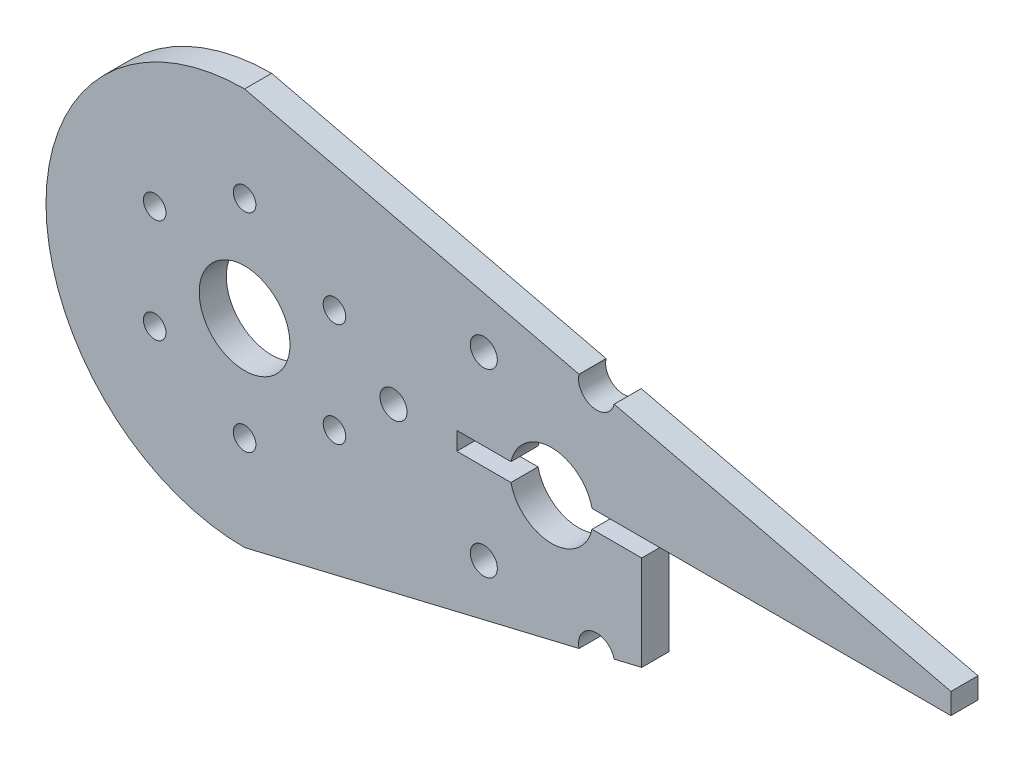
ISO-10303-21;
HEADER;
FILE_DESCRIPTION(('STEP AP214'),'2;1');
FILE_NAME('part.step','',(''),(''),'','','');
FILE_SCHEMA(('AUTOMOTIVE_DESIGN { 1 0 10303 214 1 1 1 1 }'));
ENDSEC;
DATA;
#1=APPLICATION_CONTEXT('core data for automotive mechanical design processes');
#2=APPLICATION_PROTOCOL_DEFINITION('international standard','automotive_design',2000,#1);
#3=PRODUCT_CONTEXT('',#1,'mechanical');
#4=PRODUCT('Part','Part','',(#3));
#5=PRODUCT_RELATED_PRODUCT_CATEGORY('part','',(#4));
#6=PRODUCT_DEFINITION_FORMATION('','',#4);
#7=PRODUCT_DEFINITION_CONTEXT('part definition',#1,'design');
#8=PRODUCT_DEFINITION('design','',#6,#7);
#9=PRODUCT_DEFINITION_SHAPE('','',#8);
#10=(LENGTH_UNIT() NAMED_UNIT(*) SI_UNIT(.MILLI.,.METRE.));
#11=(NAMED_UNIT(*) PLANE_ANGLE_UNIT() SI_UNIT($,.RADIAN.));
#12=(NAMED_UNIT(*) SI_UNIT($,.STERADIAN.) SOLID_ANGLE_UNIT());
#13=UNCERTAINTY_MEASURE_WITH_UNIT(LENGTH_MEASURE(1.E-05),#10,'distance_accuracy_value','');
#14=(GEOMETRIC_REPRESENTATION_CONTEXT(3) GLOBAL_UNCERTAINTY_ASSIGNED_CONTEXT((#13)) GLOBAL_UNIT_ASSIGNED_CONTEXT((#10,
#11,#12)) REPRESENTATION_CONTEXT('',''));
#15=CARTESIAN_POINT('',(0.,0.,0.));
#16=DIRECTION('',(0.,0.,1.));
#17=DIRECTION('',(1.,0.,0.));
#18=AXIS2_PLACEMENT_3D('',#15,#16,#17);
#19=CARTESIAN_POINT('',(5.00100483165142,-11.5010048316527,3.));
#20=DIRECTION('',(-0.232139621887318,0.972682474371782,0.));
#21=DIRECTION('',(-0.972682474371782,-0.232139621887318,0.));
#22=AXIS2_PLACEMENT_3D('',#19,#20,#21);
#23=PLANE('',#22);
#24=DIRECTION('',(0.972682474371782,0.232139621887318,0.));
#25=VECTOR('',#24,1.);
#26=CARTESIAN_POINT('',(5.00100483165142,-11.5010048316527,3.));
#27=LINE('',#26,#25);
#28=CARTESIAN_POINT('',(1.94536494874356,-12.2302614037938,3.));
#29=VERTEX_POINT('',#28);
#30=CARTESIAN_POINT('',(5.00100483165142,-11.5010048316527,3.));
#31=VERTEX_POINT('',#30);
#32=EDGE_CURVE('E229',#29,#31,#27,.T.);
#33=ORIENTED_EDGE('',*,*,#32,.F.);
#34=DIRECTION('',(0.,0.,-1.));
#35=VECTOR('',#34,1.);
#36=CARTESIAN_POINT('',(1.94536494874356,-12.2302614037938,4.));
#37=LINE('',#36,#35);
#38=CARTESIAN_POINT('',(1.94536494874356,-12.2302614037938,0.));
#39=VERTEX_POINT('',#38);
#40=EDGE_CURVE('E11',#29,#39,#37,.T.);
#41=ORIENTED_EDGE('',*,*,#40,.T.);
#42=DIRECTION('',(0.972682474371782,0.232139621887318,0.));
#43=VECTOR('',#42,1.);
#44=CARTESIAN_POINT('',(5.00100483165142,-11.5010048316527,0.));
#45=LINE('',#44,#43);
#46=CARTESIAN_POINT('',(5.00100483165142,-11.5010048316527,0.));
#47=VERTEX_POINT('',#46);
#48=EDGE_CURVE('E254',#39,#47,#45,.T.);
#49=ORIENTED_EDGE('',*,*,#48,.T.);
#50=DIRECTION('',(0.,0.,-1.));
#51=VECTOR('',#50,1.);
#52=CARTESIAN_POINT('',(5.00100483165142,-11.5010048316527,3.));
#53=LINE('',#52,#51);
#54=EDGE_CURVE('E208',#31,#47,#53,.T.);
#55=ORIENTED_EDGE('',*,*,#54,.F.);
#56=EDGE_LOOP('',(#33,#41,#49,#55));
#57=FACE_BOUND('',#56,.T.);
#58=ADVANCED_FACE('F35',(#57),#23,.F.);
#59=CARTESIAN_POINT('',(5.00100483165142,11.5010048316527,3.));
#60=DIRECTION('',(-0.232139621887318,-0.972682474371782,0.));
#61=DIRECTION('',(0.972682474371782,-0.232139621887318,0.));
#62=AXIS2_PLACEMENT_3D('',#59,#60,#61);
#63=PLANE('',#62);
#64=DIRECTION('',(-0.972682474371782,0.232139621887318,0.));
#65=VECTOR('',#64,1.);
#66=CARTESIAN_POINT('',(5.00100483165142,11.5010048316527,3.));
#67=LINE('',#66,#65);
#68=CARTESIAN_POINT('',(-1.94536494874356,13.158819891343,3.));
#69=VERTEX_POINT('',#68);
#70=CARTESIAN_POINT('',(-38.9989951683486,22.0020096633054,3.));
#71=VERTEX_POINT('',#70);
#72=EDGE_CURVE('E162',#69,#71,#67,.T.);
#73=ORIENTED_EDGE('',*,*,#72,.F.);
#74=DIRECTION('',(0.,0.,-1.));
#75=VECTOR('',#74,1.);
#76=CARTESIAN_POINT('',(-1.94536494874356,13.158819891343,4.));
#77=LINE('',#76,#75);
#78=CARTESIAN_POINT('',(-1.94536494874356,13.158819891343,0.));
#79=VERTEX_POINT('',#78);
#80=EDGE_CURVE('E149',#69,#79,#77,.T.);
#81=ORIENTED_EDGE('',*,*,#80,.T.);
#82=DIRECTION('',(-0.972682474371782,0.232139621887318,0.));
#83=VECTOR('',#82,1.);
#84=CARTESIAN_POINT('',(5.00100483165142,11.5010048316527,0.));
#85=LINE('',#84,#83);
#86=CARTESIAN_POINT('',(-38.9989951683486,22.0020096633054,0.));
#87=VERTEX_POINT('',#86);
#88=EDGE_CURVE('E160',#79,#87,#85,.T.);
#89=ORIENTED_EDGE('',*,*,#88,.T.);
#90=DIRECTION('',(0.,0.,-1.));
#91=VECTOR('',#90,1.);
#92=CARTESIAN_POINT('',(-38.9989951683486,22.0020096633054,3.));
#93=LINE('',#92,#91);
#94=EDGE_CURVE('E178',#71,#87,#93,.T.);
#95=ORIENTED_EDGE('',*,*,#94,.F.);
#96=EDGE_LOOP('',(#73,#81,#89,#95));
#97=FACE_BOUND('',#96,.T.);
#98=ADVANCED_FACE('F158',(#97),#63,.F.);
#99=CARTESIAN_POINT('',(-38.9989951683486,0.,3.));
#100=DIRECTION('',(0.,0.,1.));
#101=DIRECTION('',(1.,0.,0.));
#102=AXIS2_PLACEMENT_3D('',#99,#100,#101);
#103=PLANE('',#102);
#104=CARTESIAN_POINT('',(0.,12.6945406475684,3.));
#105=DIRECTION('',(0.,0.,1.));
#106=DIRECTION('',(1.,0.,0.));
#107=AXIS2_PLACEMENT_3D('',#104,#105,#106);
#108=CIRCLE('',#107,2.);
#109=CARTESIAN_POINT('',(1.94536494874357,12.2302614037938,3.));
#110=VERTEX_POINT('',#109);
#111=EDGE_CURVE('E58',#69,#110,#108,.T.);
#112=ORIENTED_EDGE('',*,*,#111,.F.);
#113=ORIENTED_EDGE('',*,*,#72,.T.);
#114=CARTESIAN_POINT('',(-38.9989951683486,0.,3.));
#115=DIRECTION('',(0.,0.,1.));
#116=DIRECTION('',(1.,0.,0.));
#117=AXIS2_PLACEMENT_3D('',#114,#115,#116);
#118=CIRCLE('',#117,22.0020096633054);
#119=CARTESIAN_POINT('',(-38.9989951683486,-22.0020096633054,3.));
#120=VERTEX_POINT('',#119);
#121=EDGE_CURVE('E172',#71,#120,#118,.T.);
#122=ORIENTED_EDGE('',*,*,#121,.T.);
#123=CARTESIAN_POINT('',(-1.94536494874357,-13.158819891343,3.));
#124=VERTEX_POINT('',#123);
#125=EDGE_CURVE('E218',#120,#124,#27,.T.);
#126=ORIENTED_EDGE('',*,*,#125,.T.);
#127=CARTESIAN_POINT('',(0.,-12.6945406475684,3.));
#128=DIRECTION('',(0.,0.,1.));
#129=DIRECTION('',(1.,0.,0.));
#130=AXIS2_PLACEMENT_3D('',#127,#128,#129);
#131=CIRCLE('',#130,2.);
#132=EDGE_CURVE('E50',#29,#124,#131,.T.);
#133=ORIENTED_EDGE('',*,*,#132,.F.);
#134=ORIENTED_EDGE('',*,*,#32,.T.);
#135=DIRECTION('',(0.,1.,0.));
#136=VECTOR('',#135,1.);
#137=CARTESIAN_POINT('',(5.00100483165142,-1.,3.));
#138=LINE('',#137,#136);
#139=CARTESIAN_POINT('',(5.00100483165142,-1.,3.));
#140=VERTEX_POINT('',#139);
#141=EDGE_CURVE('E228',#31,#140,#138,.T.);
#142=ORIENTED_EDGE('',*,*,#141,.T.);
#143=DIRECTION('',(-1.,0.,0.));
#144=VECTOR('',#143,1.);
#145=CARTESIAN_POINT('',(5.00100483165142,-1.,3.));
#146=LINE('',#145,#144);
#147=CARTESIAN_POINT('',(-0.509006304219855,-1.,3.));
#148=VERTEX_POINT('',#147);
#149=EDGE_CURVE('E231',#140,#148,#146,.T.);
#150=ORIENTED_EDGE('',*,*,#149,.T.);
#151=CARTESIAN_POINT('',(-4.99899516834858,0.,3.));
#152=DIRECTION('',(0.,0.,-1.));
#153=DIRECTION('',(-1.,0.,0.));
#154=AXIS2_PLACEMENT_3D('',#151,#152,#153);
#155=CIRCLE('',#154,4.6);
#156=CARTESIAN_POINT('',(-9.48898403247731,-1.,3.));
#157=VERTEX_POINT('',#156);
#158=EDGE_CURVE('E237',#148,#157,#155,.T.);
#159=ORIENTED_EDGE('',*,*,#158,.T.);
#160=DIRECTION('',(-1.,0.,0.));
#161=VECTOR('',#160,1.);
#162=CARTESIAN_POINT('',(-15.4889840324773,-1.,3.));
#163=LINE('',#162,#161);
#164=CARTESIAN_POINT('',(-15.4889840324773,-1.,3.));
#165=VERTEX_POINT('',#164);
#166=EDGE_CURVE('E239',#157,#165,#163,.T.);
#167=ORIENTED_EDGE('',*,*,#166,.T.);
#168=DIRECTION('',(0.,1.,0.));
#169=VECTOR('',#168,1.);
#170=CARTESIAN_POINT('',(-15.4889840324773,1.,3.));
#171=LINE('',#170,#169);
#172=CARTESIAN_POINT('',(-15.4889840324773,1.,3.));
#173=VERTEX_POINT('',#172);
#174=EDGE_CURVE('E241',#165,#173,#171,.T.);
#175=ORIENTED_EDGE('',*,*,#174,.T.);
#176=DIRECTION('',(1.,0.,0.));
#177=VECTOR('',#176,1.);
#178=CARTESIAN_POINT('',(-15.4889840324773,1.,3.));
#179=LINE('',#178,#177);
#180=CARTESIAN_POINT('',(-9.48898403247731,1.,3.));
#181=VERTEX_POINT('',#180);
#182=EDGE_CURVE('E243',#173,#181,#179,.T.);
#183=ORIENTED_EDGE('',*,*,#182,.T.);
#184=CARTESIAN_POINT('',(-4.99899516834858,0.,3.));
#185=DIRECTION('',(0.,0.,-1.));
#186=DIRECTION('',(1.,0.,0.));
#187=AXIS2_PLACEMENT_3D('',#184,#185,#186);
#188=CIRCLE('',#187,4.6);
#189=CARTESIAN_POINT('',(-0.509006304219855,1.,3.));
#190=VERTEX_POINT('',#189);
#191=EDGE_CURVE('E245',#181,#190,#188,.T.);
#192=ORIENTED_EDGE('',*,*,#191,.T.);
#193=DIRECTION('',(1.,0.,0.));
#194=VECTOR('',#193,1.);
#195=CARTESIAN_POINT('',(5.00100483165142,1.,3.));
#196=LINE('',#195,#194);
#197=CARTESIAN_POINT('',(39.2548128748764,1.,3.));
#198=VERTEX_POINT('',#197);
#199=EDGE_CURVE('E247',#190,#198,#196,.T.);
#200=ORIENTED_EDGE('',*,*,#199,.T.);
#201=DIRECTION('',(0.,1.,0.));
#202=VECTOR('',#201,1.);
#203=CARTESIAN_POINT('',(39.2548128748764,3.32601838246157,3.));
#204=LINE('',#203,#202);
#205=CARTESIAN_POINT('',(39.2548128748764,3.32601838246157,3.));
#206=VERTEX_POINT('',#205);
#207=EDGE_CURVE('E249',#198,#206,#204,.T.);
#208=ORIENTED_EDGE('',*,*,#207,.T.);
#209=EDGE_CURVE('E181',#206,#110,#67,.T.);
#210=ORIENTED_EDGE('',*,*,#209,.T.);
#211=EDGE_LOOP('',(#112,#113,#122,#126,#133,#134,#142,#150,#159,#167,#175,#183,#192,#200,#208,#210));
#212=FACE_BOUND('',#211,.T.);
#213=CARTESIAN_POINT('',(-29.0397030248275,5.7499999999999,3.));
#214=DIRECTION('',(0.,0.,1.));
#215=DIRECTION('',(1.,0.,0.));
#216=AXIS2_PLACEMENT_3D('',#213,#214,#215);
#217=CIRCLE('',#216,1.25);
#218=CARTESIAN_POINT('',(-27.7897030248275,5.7499999999999,3.));
#219=VERTEX_POINT('',#218);
#220=EDGE_CURVE('E333',#219,#219,#217,.T.);
#221=ORIENTED_EDGE('',*,*,#220,.F.);
#222=EDGE_LOOP('',(#221));
#223=FACE_BOUND('',#222,.T.);
#224=CARTESIAN_POINT('',(-38.9989951683485,11.5,3.));
#225=DIRECTION('',(0.,0.,1.));
#226=DIRECTION('',(1.,0.,0.));
#227=AXIS2_PLACEMENT_3D('',#224,#225,#226);
#228=CIRCLE('',#227,1.24999999999999);
#229=CARTESIAN_POINT('',(-37.7489951683485,11.5,3.));
#230=VERTEX_POINT('',#229);
#231=EDGE_CURVE('E345',#230,#230,#228,.T.);
#232=ORIENTED_EDGE('',*,*,#231,.F.);
#233=EDGE_LOOP('',(#232));
#234=FACE_BOUND('',#233,.T.);
#235=CARTESIAN_POINT('',(-38.9989951683486,-11.5,3.));
#236=DIRECTION('',(0.,0.,1.));
#237=DIRECTION('',(1.,0.,0.));
#238=AXIS2_PLACEMENT_3D('',#235,#236,#237);
#239=CIRCLE('',#238,1.25);
#240=CARTESIAN_POINT('',(-37.7489951683486,-11.5,3.));
#241=VERTEX_POINT('',#240);
#242=EDGE_CURVE('E357',#241,#241,#239,.T.);
#243=ORIENTED_EDGE('',*,*,#242,.F.);
#244=EDGE_LOOP('',(#243));
#245=FACE_BOUND('',#244,.T.);
#246=CARTESIAN_POINT('',(-48.9582873118696,5.75000000000005,3.));
#247=DIRECTION('',(0.,0.,1.));
#248=DIRECTION('',(1.,0.,0.));
#249=AXIS2_PLACEMENT_3D('',#246,#247,#248);
#250=CIRCLE('',#249,1.25);
#251=CARTESIAN_POINT('',(-47.7082873118696,5.75000000000005,3.));
#252=VERTEX_POINT('',#251);
#253=EDGE_CURVE('E369',#252,#252,#250,.T.);
#254=ORIENTED_EDGE('',*,*,#253,.F.);
#255=EDGE_LOOP('',(#254));
#256=FACE_BOUND('',#255,.T.);
#257=CARTESIAN_POINT('',(-48.9582873118697,-5.74999999999985,3.));
#258=DIRECTION('',(0.,0.,1.));
#259=DIRECTION('',(1.,0.,0.));
#260=AXIS2_PLACEMENT_3D('',#257,#258,#259);
#261=CIRCLE('',#260,1.25);
#262=CARTESIAN_POINT('',(-47.7082873118697,-5.74999999999985,3.));
#263=VERTEX_POINT('',#262);
#264=EDGE_CURVE('E255',#263,#263,#261,.T.);
#265=ORIENTED_EDGE('',*,*,#264,.F.);
#266=EDGE_LOOP('',(#265));
#267=FACE_BOUND('',#266,.T.);
#268=CARTESIAN_POINT('',(-12.4989951683486,10.,3.));
#269=DIRECTION('',(0.,0.,1.));
#270=DIRECTION('',(-1.,0.,0.));
#271=AXIS2_PLACEMENT_3D('',#268,#269,#270);
#272=CIRCLE('',#271,1.5);
#273=CARTESIAN_POINT('',(-13.9989951683486,10.,3.));
#274=VERTEX_POINT('',#273);
#275=EDGE_CURVE('E375',#274,#274,#272,.T.);
#276=ORIENTED_EDGE('',*,*,#275,.F.);
#277=EDGE_LOOP('',(#276));
#278=FACE_BOUND('',#277,.T.);
#279=CARTESIAN_POINT('',(-38.9989951683486,0.,3.));
#280=DIRECTION('',(0.,0.,1.));
#281=DIRECTION('',(1.,0.,0.));
#282=AXIS2_PLACEMENT_3D('',#279,#280,#281);
#283=CIRCLE('',#282,5.03);
#284=CARTESIAN_POINT('',(-33.9689951683486,0.,3.));
#285=VERTEX_POINT('',#284);
#286=EDGE_CURVE('E363',#285,#285,#283,.T.);
#287=ORIENTED_EDGE('',*,*,#286,.F.);
#288=EDGE_LOOP('',(#287));
#289=FACE_BOUND('',#288,.T.);
#290=CARTESIAN_POINT('',(-12.4989951683486,-10.,3.));
#291=DIRECTION('',(0.,0.,1.));
#292=DIRECTION('',(1.,0.,0.));
#293=AXIS2_PLACEMENT_3D('',#290,#291,#292);
#294=CIRCLE('',#293,1.5);
#295=CARTESIAN_POINT('',(-10.9989951683486,-10.,3.));
#296=VERTEX_POINT('',#295);
#297=EDGE_CURVE('E351',#296,#296,#294,.T.);
#298=ORIENTED_EDGE('',*,*,#297,.F.);
#299=EDGE_LOOP('',(#298));
#300=FACE_BOUND('',#299,.T.);
#301=CARTESIAN_POINT('',(-22.4989951683486,0.,3.));
#302=DIRECTION('',(0.,0.,1.));
#303=DIRECTION('',(1.,0.,0.));
#304=AXIS2_PLACEMENT_3D('',#301,#302,#303);
#305=CIRCLE('',#304,1.5);
#306=CARTESIAN_POINT('',(-20.9989951683486,0.,3.));
#307=VERTEX_POINT('',#306);
#308=EDGE_CURVE('E339',#307,#307,#305,.T.);
#309=ORIENTED_EDGE('',*,*,#308,.F.);
#310=EDGE_LOOP('',(#309));
#311=FACE_BOUND('',#310,.T.);
#312=CARTESIAN_POINT('',(-29.0397030248276,-5.75000000000012,3.));
#313=DIRECTION('',(0.,0.,1.));
#314=DIRECTION('',(1.,0.,0.));
#315=AXIS2_PLACEMENT_3D('',#312,#313,#314);
#316=CIRCLE('',#315,1.25);
#317=CARTESIAN_POINT('',(-27.7897030248276,-5.75000000000012,3.));
#318=VERTEX_POINT('',#317);
#319=EDGE_CURVE('E327',#318,#318,#316,.T.);
#320=ORIENTED_EDGE('',*,*,#319,.F.);
#321=EDGE_LOOP('',(#320));
#322=FACE_BOUND('',#321,.T.);
#323=ADVANCED_FACE('F223',(#212,#223,#234,#245,#256,#267,#278,#289,#300,#311,#322),#103,.T.);
#324=CARTESIAN_POINT('',(-38.9989951683486,0.,0.));
#325=DIRECTION('',(0.,0.,1.));
#326=DIRECTION('',(1.,0.,0.));
#327=AXIS2_PLACEMENT_3D('',#324,#325,#326);
#328=PLANE('',#327);
#329=ORIENTED_EDGE('',*,*,#88,.F.);
#330=CARTESIAN_POINT('',(0.,12.6945406475684,0.));
#331=DIRECTION('',(0.,0.,-1.));
#332=DIRECTION('',(-1.,0.,0.));
#333=AXIS2_PLACEMENT_3D('',#330,#331,#332);
#334=CIRCLE('',#333,2.);
#335=CARTESIAN_POINT('',(1.94536494874357,12.2302614037938,0.));
#336=VERTEX_POINT('',#335);
#337=EDGE_CURVE('E146',#336,#79,#334,.T.);
#338=ORIENTED_EDGE('',*,*,#337,.F.);
#339=CARTESIAN_POINT('',(39.2548128748764,3.32601838246157,0.));
#340=VERTEX_POINT('',#339);
#341=EDGE_CURVE('E169',#340,#336,#85,.T.);
#342=ORIENTED_EDGE('',*,*,#341,.F.);
#343=DIRECTION('',(0.,1.,0.));
#344=VECTOR('',#343,1.);
#345=CARTESIAN_POINT('',(39.2548128748764,3.32601838246157,0.));
#346=LINE('',#345,#344);
#347=CARTESIAN_POINT('',(39.2548128748764,1.,0.));
#348=VERTEX_POINT('',#347);
#349=EDGE_CURVE('E170',#348,#340,#346,.T.);
#350=ORIENTED_EDGE('',*,*,#349,.F.);
#351=DIRECTION('',(1.,0.,0.));
#352=VECTOR('',#351,1.);
#353=CARTESIAN_POINT('',(5.00100483165142,1.,0.));
#354=LINE('',#353,#352);
#355=CARTESIAN_POINT('',(-0.509006304219855,1.,0.));
#356=VERTEX_POINT('',#355);
#357=EDGE_CURVE('E174',#356,#348,#354,.T.);
#358=ORIENTED_EDGE('',*,*,#357,.F.);
#359=CARTESIAN_POINT('',(-4.99899516834858,0.,0.));
#360=DIRECTION('',(0.,0.,-1.));
#361=DIRECTION('',(1.,0.,0.));
#362=AXIS2_PLACEMENT_3D('',#359,#360,#361);
#363=CIRCLE('',#362,4.6);
#364=CARTESIAN_POINT('',(-9.48898403247731,1.,0.));
#365=VERTEX_POINT('',#364);
#366=EDGE_CURVE('E269',#365,#356,#363,.T.);
#367=ORIENTED_EDGE('',*,*,#366,.F.);
#368=DIRECTION('',(1.,0.,0.));
#369=VECTOR('',#368,1.);
#370=CARTESIAN_POINT('',(-15.4889840324773,1.,0.));
#371=LINE('',#370,#369);
#372=CARTESIAN_POINT('',(-15.4889840324773,1.,0.));
#373=VERTEX_POINT('',#372);
#374=EDGE_CURVE('E267',#373,#365,#371,.T.);
#375=ORIENTED_EDGE('',*,*,#374,.F.);
#376=DIRECTION('',(0.,1.,0.));
#377=VECTOR('',#376,1.);
#378=CARTESIAN_POINT('',(-15.4889840324773,1.,0.));
#379=LINE('',#378,#377);
#380=CARTESIAN_POINT('',(-15.4889840324773,-1.,0.));
#381=VERTEX_POINT('',#380);
#382=EDGE_CURVE('E265',#381,#373,#379,.T.);
#383=ORIENTED_EDGE('',*,*,#382,.F.);
#384=DIRECTION('',(-1.,0.,0.));
#385=VECTOR('',#384,1.);
#386=CARTESIAN_POINT('',(-15.4889840324773,-1.,0.));
#387=LINE('',#386,#385);
#388=CARTESIAN_POINT('',(-9.48898403247731,-1.,0.));
#389=VERTEX_POINT('',#388);
#390=EDGE_CURVE('E263',#389,#381,#387,.T.);
#391=ORIENTED_EDGE('',*,*,#390,.F.);
#392=CARTESIAN_POINT('',(-4.99899516834858,0.,0.));
#393=DIRECTION('',(0.,0.,-1.));
#394=DIRECTION('',(-1.,0.,0.));
#395=AXIS2_PLACEMENT_3D('',#392,#393,#394);
#396=CIRCLE('',#395,4.6);
#397=CARTESIAN_POINT('',(-0.509006304219855,-1.,0.));
#398=VERTEX_POINT('',#397);
#399=EDGE_CURVE('E261',#398,#389,#396,.T.);
#400=ORIENTED_EDGE('',*,*,#399,.F.);
#401=DIRECTION('',(-1.,0.,0.));
#402=VECTOR('',#401,1.);
#403=CARTESIAN_POINT('',(5.00100483165142,-1.,0.));
#404=LINE('',#403,#402);
#405=CARTESIAN_POINT('',(5.00100483165142,-1.,0.));
#406=VERTEX_POINT('',#405);
#407=EDGE_CURVE('E259',#406,#398,#404,.T.);
#408=ORIENTED_EDGE('',*,*,#407,.F.);
#409=DIRECTION('',(0.,1.,0.));
#410=VECTOR('',#409,1.);
#411=CARTESIAN_POINT('',(5.00100483165142,-1.,0.));
#412=LINE('',#411,#410);
#413=EDGE_CURVE('E257',#47,#406,#412,.T.);
#414=ORIENTED_EDGE('',*,*,#413,.F.);
#415=ORIENTED_EDGE('',*,*,#48,.F.);
#416=CARTESIAN_POINT('',(0.,-12.6945406475684,0.));
#417=DIRECTION('',(0.,0.,-1.));
#418=DIRECTION('',(-1.,0.,0.));
#419=AXIS2_PLACEMENT_3D('',#416,#417,#418);
#420=CIRCLE('',#419,2.);
#421=CARTESIAN_POINT('',(-1.94536494874357,-13.158819891343,0.));
#422=VERTEX_POINT('',#421);
#423=EDGE_CURVE('E154',#422,#39,#420,.T.);
#424=ORIENTED_EDGE('',*,*,#423,.F.);
#425=CARTESIAN_POINT('',(-38.9989951683486,-22.0020096633054,0.));
#426=VERTEX_POINT('',#425);
#427=EDGE_CURVE('E220',#426,#422,#45,.T.);
#428=ORIENTED_EDGE('',*,*,#427,.F.);
#429=CARTESIAN_POINT('',(-38.9989951683486,0.,0.));
#430=DIRECTION('',(0.,0.,1.));
#431=DIRECTION('',(1.,0.,0.));
#432=AXIS2_PLACEMENT_3D('',#429,#430,#431);
#433=CIRCLE('',#432,22.0020096633054);
#434=EDGE_CURVE('E168',#87,#426,#433,.T.);
#435=ORIENTED_EDGE('',*,*,#434,.F.);
#436=EDGE_LOOP('',(#329,#338,#342,#350,#358,#367,#375,#383,#391,#400,#408,#414,#415,#424,#428,#435));
#437=FACE_BOUND('',#436,.T.);
#438=CARTESIAN_POINT('',(-48.9582873118697,-5.74999999999985,0.));
#439=DIRECTION('',(0.,0.,1.));
#440=DIRECTION('',(1.,0.,0.));
#441=AXIS2_PLACEMENT_3D('',#438,#439,#440);
#442=CIRCLE('',#441,1.25);
#443=CARTESIAN_POINT('',(-47.7082873118697,-5.74999999999985,0.));
#444=VERTEX_POINT('',#443);
#445=EDGE_CURVE('E378',#444,#444,#442,.T.);
#446=ORIENTED_EDGE('',*,*,#445,.T.);
#447=EDGE_LOOP('',(#446));
#448=FACE_BOUND('',#447,.T.);
#449=CARTESIAN_POINT('',(-12.4989951683486,10.,0.));
#450=DIRECTION('',(0.,0.,1.));
#451=DIRECTION('',(-1.,0.,0.));
#452=AXIS2_PLACEMENT_3D('',#449,#450,#451);
#453=CIRCLE('',#452,1.5);
#454=CARTESIAN_POINT('',(-13.9989951683486,10.,0.));
#455=VERTEX_POINT('',#454);
#456=EDGE_CURVE('E372',#455,#455,#453,.T.);
#457=ORIENTED_EDGE('',*,*,#456,.T.);
#458=EDGE_LOOP('',(#457));
#459=FACE_BOUND('',#458,.T.);
#460=CARTESIAN_POINT('',(-48.9582873118696,5.75000000000005,0.));
#461=DIRECTION('',(0.,0.,1.));
#462=DIRECTION('',(1.,0.,0.));
#463=AXIS2_PLACEMENT_3D('',#460,#461,#462);
#464=CIRCLE('',#463,1.25);
#465=CARTESIAN_POINT('',(-47.7082873118696,5.75000000000005,0.));
#466=VERTEX_POINT('',#465);
#467=EDGE_CURVE('E366',#466,#466,#464,.T.);
#468=ORIENTED_EDGE('',*,*,#467,.T.);
#469=EDGE_LOOP('',(#468));
#470=FACE_BOUND('',#469,.T.);
#471=CARTESIAN_POINT('',(-38.9989951683486,0.,0.));
#472=DIRECTION('',(0.,0.,1.));
#473=DIRECTION('',(1.,0.,0.));
#474=AXIS2_PLACEMENT_3D('',#471,#472,#473);
#475=CIRCLE('',#474,5.03);
#476=CARTESIAN_POINT('',(-33.9689951683486,0.,0.));
#477=VERTEX_POINT('',#476);
#478=EDGE_CURVE('E360',#477,#477,#475,.T.);
#479=ORIENTED_EDGE('',*,*,#478,.T.);
#480=EDGE_LOOP('',(#479));
#481=FACE_BOUND('',#480,.T.);
#482=CARTESIAN_POINT('',(-38.9989951683486,-11.5,0.));
#483=DIRECTION('',(0.,0.,1.));
#484=DIRECTION('',(1.,0.,0.));
#485=AXIS2_PLACEMENT_3D('',#482,#483,#484);
#486=CIRCLE('',#485,1.25);
#487=CARTESIAN_POINT('',(-37.7489951683486,-11.5,0.));
#488=VERTEX_POINT('',#487);
#489=EDGE_CURVE('E354',#488,#488,#486,.T.);
#490=ORIENTED_EDGE('',*,*,#489,.T.);
#491=EDGE_LOOP('',(#490));
#492=FACE_BOUND('',#491,.T.);
#493=CARTESIAN_POINT('',(-12.4989951683486,-10.,0.));
#494=DIRECTION('',(0.,0.,1.));
#495=DIRECTION('',(1.,0.,0.));
#496=AXIS2_PLACEMENT_3D('',#493,#494,#495);
#497=CIRCLE('',#496,1.5);
#498=CARTESIAN_POINT('',(-10.9989951683486,-10.,0.));
#499=VERTEX_POINT('',#498);
#500=EDGE_CURVE('E348',#499,#499,#497,.T.);
#501=ORIENTED_EDGE('',*,*,#500,.T.);
#502=EDGE_LOOP('',(#501));
#503=FACE_BOUND('',#502,.T.);
#504=CARTESIAN_POINT('',(-38.9989951683485,11.5,0.));
#505=DIRECTION('',(0.,0.,1.));
#506=DIRECTION('',(1.,0.,0.));
#507=AXIS2_PLACEMENT_3D('',#504,#505,#506);
#508=CIRCLE('',#507,1.24999999999999);
#509=CARTESIAN_POINT('',(-37.7489951683485,11.5,0.));
#510=VERTEX_POINT('',#509);
#511=EDGE_CURVE('E342',#510,#510,#508,.T.);
#512=ORIENTED_EDGE('',*,*,#511,.T.);
#513=EDGE_LOOP('',(#512));
#514=FACE_BOUND('',#513,.T.);
#515=CARTESIAN_POINT('',(-22.4989951683486,0.,0.));
#516=DIRECTION('',(0.,0.,1.));
#517=DIRECTION('',(1.,0.,0.));
#518=AXIS2_PLACEMENT_3D('',#515,#516,#517);
#519=CIRCLE('',#518,1.5);
#520=CARTESIAN_POINT('',(-20.9989951683486,0.,0.));
#521=VERTEX_POINT('',#520);
#522=EDGE_CURVE('E336',#521,#521,#519,.T.);
#523=ORIENTED_EDGE('',*,*,#522,.T.);
#524=EDGE_LOOP('',(#523));
#525=FACE_BOUND('',#524,.T.);
#526=CARTESIAN_POINT('',(-29.0397030248275,5.7499999999999,0.));
#527=DIRECTION('',(0.,0.,1.));
#528=DIRECTION('',(1.,0.,0.));
#529=AXIS2_PLACEMENT_3D('',#526,#527,#528);
#530=CIRCLE('',#529,1.25);
#531=CARTESIAN_POINT('',(-27.7897030248275,5.7499999999999,0.));
#532=VERTEX_POINT('',#531);
#533=EDGE_CURVE('E330',#532,#532,#530,.T.);
#534=ORIENTED_EDGE('',*,*,#533,.T.);
#535=EDGE_LOOP('',(#534));
#536=FACE_BOUND('',#535,.T.);
#537=CARTESIAN_POINT('',(-29.0397030248276,-5.75000000000012,0.));
#538=DIRECTION('',(0.,0.,1.));
#539=DIRECTION('',(1.,0.,0.));
#540=AXIS2_PLACEMENT_3D('',#537,#538,#539);
#541=CIRCLE('',#540,1.25);
#542=CARTESIAN_POINT('',(-27.7897030248276,-5.75000000000012,0.));
#543=VERTEX_POINT('',#542);
#544=EDGE_CURVE('E326',#543,#543,#541,.T.);
#545=ORIENTED_EDGE('',*,*,#544,.T.);
#546=EDGE_LOOP('',(#545));
#547=FACE_BOUND('',#546,.T.);
#548=ADVANCED_FACE('F165',(#437,#448,#459,#470,#481,#492,#503,#514,#525,#536,#547),#328,.F.);
#549=CARTESIAN_POINT('',(-38.9989951683486,0.,3.));
#550=DIRECTION('',(0.,0.,-1.));
#551=DIRECTION('',(-1.,0.,0.));
#552=AXIS2_PLACEMENT_3D('',#549,#550,#551);
#553=CYLINDRICAL_SURFACE('',#552,22.0020096633054);
#554=ORIENTED_EDGE('',*,*,#434,.T.);
#555=DIRECTION('',(0.,0.,-1.));
#556=VECTOR('',#555,1.);
#557=CARTESIAN_POINT('',(-38.9989951683486,-22.0020096633054,3.));
#558=LINE('',#557,#556);
#559=EDGE_CURVE('E211',#120,#426,#558,.T.);
#560=ORIENTED_EDGE('',*,*,#559,.F.);
#561=ORIENTED_EDGE('',*,*,#121,.F.);
#562=ORIENTED_EDGE('',*,*,#94,.T.);
#563=EDGE_LOOP('',(#554,#560,#561,#562));
#564=FACE_BOUND('',#563,.T.);
#565=ADVANCED_FACE('F37',(#564),#553,.T.);
#566=ORIENTED_EDGE('',*,*,#427,.T.);
#567=DIRECTION('',(0.,0.,-1.));
#568=VECTOR('',#567,1.);
#569=CARTESIAN_POINT('',(-1.94536494874357,-13.158819891343,4.));
#570=LINE('',#569,#568);
#571=EDGE_CURVE('E43',#422,#124,#570,.F.);
#572=ORIENTED_EDGE('',*,*,#571,.T.);
#573=ORIENTED_EDGE('',*,*,#125,.F.);
#574=ORIENTED_EDGE('',*,*,#559,.T.);
#575=EDGE_LOOP('',(#566,#572,#573,#574));
#576=FACE_BOUND('',#575,.T.);
#577=ADVANCED_FACE('F217',(#576),#23,.F.);
#578=CARTESIAN_POINT('',(5.00100483165142,-1.,3.));
#579=DIRECTION('',(-1.,0.,0.));
#580=DIRECTION('',(0.,0.,1.));
#581=AXIS2_PLACEMENT_3D('',#578,#579,#580);
#582=PLANE('',#581);
#583=ORIENTED_EDGE('',*,*,#413,.T.);
#584=DIRECTION('',(0.,0.,-1.));
#585=VECTOR('',#584,1.);
#586=CARTESIAN_POINT('',(5.00100483165142,-1.,3.));
#587=LINE('',#586,#585);
#588=EDGE_CURVE('E205',#140,#406,#587,.T.);
#589=ORIENTED_EDGE('',*,*,#588,.F.);
#590=ORIENTED_EDGE('',*,*,#141,.F.);
#591=ORIENTED_EDGE('',*,*,#54,.T.);
#592=EDGE_LOOP('',(#583,#589,#590,#591));
#593=FACE_BOUND('',#592,.T.);
#594=ADVANCED_FACE('F317',(#593),#582,.F.);
#595=CARTESIAN_POINT('',(5.00100483165142,-1.,3.));
#596=DIRECTION('',(0.,-1.,0.));
#597=DIRECTION('',(0.,0.,-1.));
#598=AXIS2_PLACEMENT_3D('',#595,#596,#597);
#599=PLANE('',#598);
#600=ORIENTED_EDGE('',*,*,#407,.T.);
#601=DIRECTION('',(0.,0.,-1.));
#602=VECTOR('',#601,1.);
#603=CARTESIAN_POINT('',(-0.509006304219855,-1.,3.));
#604=LINE('',#603,#602);
#605=EDGE_CURVE('E202',#148,#398,#604,.T.);
#606=ORIENTED_EDGE('',*,*,#605,.F.);
#607=ORIENTED_EDGE('',*,*,#149,.F.);
#608=ORIENTED_EDGE('',*,*,#588,.T.);
#609=EDGE_LOOP('',(#600,#606,#607,#608));
#610=FACE_BOUND('',#609,.T.);
#611=ADVANCED_FACE('F313',(#610),#599,.F.);
#612=CARTESIAN_POINT('',(-4.99899516834858,0.,3.));
#613=DIRECTION('',(0.,0.,-1.));
#614=DIRECTION('',(-1.,0.,0.));
#615=AXIS2_PLACEMENT_3D('',#612,#613,#614);
#616=CYLINDRICAL_SURFACE('',#615,4.6);
#617=ORIENTED_EDGE('',*,*,#399,.T.);
#618=DIRECTION('',(0.,0.,-1.));
#619=VECTOR('',#618,1.);
#620=CARTESIAN_POINT('',(-9.48898403247731,-1.,3.));
#621=LINE('',#620,#619);
#622=EDGE_CURVE('E199',#157,#389,#621,.T.);
#623=ORIENTED_EDGE('',*,*,#622,.F.);
#624=ORIENTED_EDGE('',*,*,#158,.F.);
#625=ORIENTED_EDGE('',*,*,#605,.T.);
#626=EDGE_LOOP('',(#617,#623,#624,#625));
#627=FACE_BOUND('',#626,.T.);
#628=ADVANCED_FACE('F308',(#627),#616,.F.);
#629=CARTESIAN_POINT('',(-15.4889840324773,-1.,3.));
#630=DIRECTION('',(0.,-1.,0.));
#631=DIRECTION('',(0.,0.,-1.));
#632=AXIS2_PLACEMENT_3D('',#629,#630,#631);
#633=PLANE('',#632);
#634=ORIENTED_EDGE('',*,*,#390,.T.);
#635=DIRECTION('',(0.,0.,-1.));
#636=VECTOR('',#635,1.);
#637=CARTESIAN_POINT('',(-15.4889840324773,-1.,3.));
#638=LINE('',#637,#636);
#639=EDGE_CURVE('E196',#165,#381,#638,.T.);
#640=ORIENTED_EDGE('',*,*,#639,.F.);
#641=ORIENTED_EDGE('',*,*,#166,.F.);
#642=ORIENTED_EDGE('',*,*,#622,.T.);
#643=EDGE_LOOP('',(#634,#640,#641,#642));
#644=FACE_BOUND('',#643,.T.);
#645=ADVANCED_FACE('F302',(#644),#633,.F.);
#646=CARTESIAN_POINT('',(-15.4889840324773,1.,3.));
#647=DIRECTION('',(-1.,0.,0.));
#648=DIRECTION('',(0.,0.,1.));
#649=AXIS2_PLACEMENT_3D('',#646,#647,#648);
#650=PLANE('',#649);
#651=ORIENTED_EDGE('',*,*,#382,.T.);
#652=DIRECTION('',(0.,0.,-1.));
#653=VECTOR('',#652,1.);
#654=CARTESIAN_POINT('',(-15.4889840324773,1.,3.));
#655=LINE('',#654,#653);
#656=EDGE_CURVE('E193',#173,#373,#655,.T.);
#657=ORIENTED_EDGE('',*,*,#656,.F.);
#658=ORIENTED_EDGE('',*,*,#174,.F.);
#659=ORIENTED_EDGE('',*,*,#639,.T.);
#660=EDGE_LOOP('',(#651,#657,#658,#659));
#661=FACE_BOUND('',#660,.T.);
#662=ADVANCED_FACE('F298',(#661),#650,.F.);
#663=CARTESIAN_POINT('',(-15.4889840324773,1.,3.));
#664=DIRECTION('',(0.,1.,0.));
#665=DIRECTION('',(0.,0.,1.));
#666=AXIS2_PLACEMENT_3D('',#663,#664,#665);
#667=PLANE('',#666);
#668=ORIENTED_EDGE('',*,*,#374,.T.);
#669=DIRECTION('',(0.,0.,-1.));
#670=VECTOR('',#669,1.);
#671=CARTESIAN_POINT('',(-9.48898403247731,1.,3.));
#672=LINE('',#671,#670);
#673=EDGE_CURVE('E190',#181,#365,#672,.T.);
#674=ORIENTED_EDGE('',*,*,#673,.F.);
#675=ORIENTED_EDGE('',*,*,#182,.F.);
#676=ORIENTED_EDGE('',*,*,#656,.T.);
#677=EDGE_LOOP('',(#668,#674,#675,#676));
#678=FACE_BOUND('',#677,.T.);
#679=ADVANCED_FACE('F294',(#678),#667,.F.);
#680=CARTESIAN_POINT('',(-4.99899516834858,0.,3.));
#681=DIRECTION('',(0.,0.,-1.));
#682=DIRECTION('',(-1.,0.,0.));
#683=AXIS2_PLACEMENT_3D('',#680,#681,#682);
#684=CYLINDRICAL_SURFACE('',#683,4.6);
#685=ORIENTED_EDGE('',*,*,#366,.T.);
#686=DIRECTION('',(0.,0.,-1.));
#687=VECTOR('',#686,1.);
#688=CARTESIAN_POINT('',(-0.509006304219855,1.,3.));
#689=LINE('',#688,#687);
#690=EDGE_CURVE('E187',#190,#356,#689,.T.);
#691=ORIENTED_EDGE('',*,*,#690,.F.);
#692=ORIENTED_EDGE('',*,*,#191,.F.);
#693=ORIENTED_EDGE('',*,*,#673,.T.);
#694=EDGE_LOOP('',(#685,#691,#692,#693));
#695=FACE_BOUND('',#694,.T.);
#696=ADVANCED_FACE('F289',(#695),#684,.F.);
#697=CARTESIAN_POINT('',(5.00100483165142,1.,3.));
#698=DIRECTION('',(0.,1.,0.));
#699=DIRECTION('',(0.,0.,1.));
#700=AXIS2_PLACEMENT_3D('',#697,#698,#699);
#701=PLANE('',#700);
#702=ORIENTED_EDGE('',*,*,#357,.T.);
#703=DIRECTION('',(0.,0.,-1.));
#704=VECTOR('',#703,1.);
#705=CARTESIAN_POINT('',(39.2548128748764,1.,3.));
#706=LINE('',#705,#704);
#707=EDGE_CURVE('E184',#198,#348,#706,.T.);
#708=ORIENTED_EDGE('',*,*,#707,.F.);
#709=ORIENTED_EDGE('',*,*,#199,.F.);
#710=ORIENTED_EDGE('',*,*,#690,.T.);
#711=EDGE_LOOP('',(#702,#708,#709,#710));
#712=FACE_BOUND('',#711,.T.);
#713=ADVANCED_FACE('F273',(#712),#701,.F.);
#714=CARTESIAN_POINT('',(39.2548128748764,3.32601838246157,3.));
#715=DIRECTION('',(-1.,0.,0.));
#716=DIRECTION('',(0.,0.,1.));
#717=AXIS2_PLACEMENT_3D('',#714,#715,#716);
#718=PLANE('',#717);
#719=ORIENTED_EDGE('',*,*,#349,.T.);
#720=DIRECTION('',(0.,0.,-1.));
#721=VECTOR('',#720,1.);
#722=CARTESIAN_POINT('',(39.2548128748764,3.32601838246157,3.));
#723=LINE('',#722,#721);
#724=EDGE_CURVE('E180',#206,#340,#723,.T.);
#725=ORIENTED_EDGE('',*,*,#724,.F.);
#726=ORIENTED_EDGE('',*,*,#207,.F.);
#727=ORIENTED_EDGE('',*,*,#707,.T.);
#728=EDGE_LOOP('',(#719,#725,#726,#727));
#729=FACE_BOUND('',#728,.T.);
#730=ADVANCED_FACE('F280',(#729),#718,.F.);
#731=ORIENTED_EDGE('',*,*,#341,.T.);
#732=DIRECTION('',(0.,0.,-1.));
#733=VECTOR('',#732,1.);
#734=CARTESIAN_POINT('',(1.94536494874357,12.2302614037938,4.));
#735=LINE('',#734,#733);
#736=EDGE_CURVE('E150',#336,#110,#735,.F.);
#737=ORIENTED_EDGE('',*,*,#736,.T.);
#738=ORIENTED_EDGE('',*,*,#209,.F.);
#739=ORIENTED_EDGE('',*,*,#724,.T.);
#740=EDGE_LOOP('',(#731,#737,#738,#739));
#741=FACE_BOUND('',#740,.T.);
#742=ADVANCED_FACE('F283',(#741),#63,.F.);
#743=CARTESIAN_POINT('',(-48.9582873118697,-5.74999999999985,3.));
#744=DIRECTION('',(0.,0.,-1.));
#745=DIRECTION('',(-1.,0.,0.));
#746=AXIS2_PLACEMENT_3D('',#743,#744,#745);
#747=CYLINDRICAL_SURFACE('',#746,1.25);
#748=ORIENTED_EDGE('',*,*,#264,.T.);
#749=EDGE_LOOP('',(#748));
#750=FACE_BOUND('',#749,.T.);
#751=ORIENTED_EDGE('',*,*,#445,.F.);
#752=EDGE_LOOP('',(#751));
#753=FACE_BOUND('',#752,.T.);
#754=ADVANCED_FACE('F386',(#750,#753),#747,.F.);
#755=CARTESIAN_POINT('',(-12.4989951683486,10.,3.));
#756=DIRECTION('',(0.,0.,-1.));
#757=DIRECTION('',(-1.,0.,0.));
#758=AXIS2_PLACEMENT_3D('',#755,#756,#757);
#759=CYLINDRICAL_SURFACE('',#758,1.5);
#760=ORIENTED_EDGE('',*,*,#275,.T.);
#761=EDGE_LOOP('',(#760));
#762=FACE_BOUND('',#761,.T.);
#763=ORIENTED_EDGE('',*,*,#456,.F.);
#764=EDGE_LOOP('',(#763));
#765=FACE_BOUND('',#764,.T.);
#766=ADVANCED_FACE('F388',(#762,#765),#759,.F.);
#767=CARTESIAN_POINT('',(-48.9582873118696,5.75000000000005,3.));
#768=DIRECTION('',(0.,0.,-1.));
#769=DIRECTION('',(-1.,0.,0.));
#770=AXIS2_PLACEMENT_3D('',#767,#768,#769);
#771=CYLINDRICAL_SURFACE('',#770,1.25);
#772=ORIENTED_EDGE('',*,*,#253,.T.);
#773=EDGE_LOOP('',(#772));
#774=FACE_BOUND('',#773,.T.);
#775=ORIENTED_EDGE('',*,*,#467,.F.);
#776=EDGE_LOOP('',(#775));
#777=FACE_BOUND('',#776,.T.);
#778=ADVANCED_FACE('F395',(#774,#777),#771,.F.);
#779=CARTESIAN_POINT('',(-38.9989951683486,0.,3.));
#780=DIRECTION('',(0.,0.,-1.));
#781=DIRECTION('',(-1.,0.,0.));
#782=AXIS2_PLACEMENT_3D('',#779,#780,#781);
#783=CYLINDRICAL_SURFACE('',#782,5.03);
#784=ORIENTED_EDGE('',*,*,#286,.T.);
#785=EDGE_LOOP('',(#784));
#786=FACE_BOUND('',#785,.T.);
#787=ORIENTED_EDGE('',*,*,#478,.F.);
#788=EDGE_LOOP('',(#787));
#789=FACE_BOUND('',#788,.T.);
#790=ADVANCED_FACE('F519',(#786,#789),#783,.F.);
#791=CARTESIAN_POINT('',(-38.9989951683486,-11.5,3.));
#792=DIRECTION('',(0.,0.,-1.));
#793=DIRECTION('',(-1.,0.,0.));
#794=AXIS2_PLACEMENT_3D('',#791,#792,#793);
#795=CYLINDRICAL_SURFACE('',#794,1.25);
#796=ORIENTED_EDGE('',*,*,#242,.T.);
#797=EDGE_LOOP('',(#796));
#798=FACE_BOUND('',#797,.T.);
#799=ORIENTED_EDGE('',*,*,#489,.F.);
#800=EDGE_LOOP('',(#799));
#801=FACE_BOUND('',#800,.T.);
#802=ADVANCED_FACE('F515',(#798,#801),#795,.F.);
#803=CARTESIAN_POINT('',(-12.4989951683486,-10.,3.));
#804=DIRECTION('',(0.,0.,-1.));
#805=DIRECTION('',(-1.,0.,0.));
#806=AXIS2_PLACEMENT_3D('',#803,#804,#805);
#807=CYLINDRICAL_SURFACE('',#806,1.5);
#808=ORIENTED_EDGE('',*,*,#297,.T.);
#809=EDGE_LOOP('',(#808));
#810=FACE_BOUND('',#809,.T.);
#811=ORIENTED_EDGE('',*,*,#500,.F.);
#812=EDGE_LOOP('',(#811));
#813=FACE_BOUND('',#812,.T.);
#814=ADVANCED_FACE('F511',(#810,#813),#807,.F.);
#815=CARTESIAN_POINT('',(-38.9989951683485,11.5,3.));
#816=DIRECTION('',(0.,0.,-1.));
#817=DIRECTION('',(-1.,0.,0.));
#818=AXIS2_PLACEMENT_3D('',#815,#816,#817);
#819=CYLINDRICAL_SURFACE('',#818,1.24999999999999);
#820=ORIENTED_EDGE('',*,*,#231,.T.);
#821=EDGE_LOOP('',(#820));
#822=FACE_BOUND('',#821,.T.);
#823=ORIENTED_EDGE('',*,*,#511,.F.);
#824=EDGE_LOOP('',(#823));
#825=FACE_BOUND('',#824,.T.);
#826=ADVANCED_FACE('F507',(#822,#825),#819,.F.);
#827=CARTESIAN_POINT('',(-22.4989951683486,0.,3.));
#828=DIRECTION('',(0.,0.,-1.));
#829=DIRECTION('',(-1.,0.,0.));
#830=AXIS2_PLACEMENT_3D('',#827,#828,#829);
#831=CYLINDRICAL_SURFACE('',#830,1.5);
#832=ORIENTED_EDGE('',*,*,#308,.T.);
#833=EDGE_LOOP('',(#832));
#834=FACE_BOUND('',#833,.T.);
#835=ORIENTED_EDGE('',*,*,#522,.F.);
#836=EDGE_LOOP('',(#835));
#837=FACE_BOUND('',#836,.T.);
#838=ADVANCED_FACE('F503',(#834,#837),#831,.F.);
#839=CARTESIAN_POINT('',(-29.0397030248275,5.7499999999999,3.));
#840=DIRECTION('',(0.,0.,-1.));
#841=DIRECTION('',(-1.,0.,0.));
#842=AXIS2_PLACEMENT_3D('',#839,#840,#841);
#843=CYLINDRICAL_SURFACE('',#842,1.25);
#844=ORIENTED_EDGE('',*,*,#220,.T.);
#845=EDGE_LOOP('',(#844));
#846=FACE_BOUND('',#845,.T.);
#847=ORIENTED_EDGE('',*,*,#533,.F.);
#848=EDGE_LOOP('',(#847));
#849=FACE_BOUND('',#848,.T.);
#850=ADVANCED_FACE('F499',(#846,#849),#843,.F.);
#851=CARTESIAN_POINT('',(-29.0397030248276,-5.75000000000012,3.));
#852=DIRECTION('',(0.,0.,-1.));
#853=DIRECTION('',(-1.,0.,0.));
#854=AXIS2_PLACEMENT_3D('',#851,#852,#853);
#855=CYLINDRICAL_SURFACE('',#854,1.25);
#856=ORIENTED_EDGE('',*,*,#319,.T.);
#857=EDGE_LOOP('',(#856));
#858=FACE_BOUND('',#857,.T.);
#859=ORIENTED_EDGE('',*,*,#544,.F.);
#860=EDGE_LOOP('',(#859));
#861=FACE_BOUND('',#860,.T.);
#862=ADVANCED_FACE('F483',(#858,#861),#855,.F.);
#863=CARTESIAN_POINT('',(0.,12.6945406475684,4.));
#864=DIRECTION('',(0.,0.,-1.));
#865=DIRECTION('',(-1.,0.,0.));
#866=AXIS2_PLACEMENT_3D('',#863,#864,#865);
#867=CYLINDRICAL_SURFACE('',#866,2.);
#868=ORIENTED_EDGE('',*,*,#111,.T.);
#869=ORIENTED_EDGE('',*,*,#736,.F.);
#870=ORIENTED_EDGE('',*,*,#337,.T.);
#871=ORIENTED_EDGE('',*,*,#80,.F.);
#872=EDGE_LOOP('',(#868,#869,#870,#871));
#873=FACE_BOUND('',#872,.T.);
#874=ADVANCED_FACE('F148',(#873),#867,.F.);
#875=CARTESIAN_POINT('',(0.,-12.6945406475684,4.));
#876=DIRECTION('',(0.,0.,-1.));
#877=DIRECTION('',(-1.,0.,0.));
#878=AXIS2_PLACEMENT_3D('',#875,#876,#877);
#879=CYLINDRICAL_SURFACE('',#878,2.);
#880=ORIENTED_EDGE('',*,*,#132,.T.);
#881=ORIENTED_EDGE('',*,*,#571,.F.);
#882=ORIENTED_EDGE('',*,*,#423,.T.);
#883=ORIENTED_EDGE('',*,*,#40,.F.);
#884=EDGE_LOOP('',(#880,#881,#882,#883));
#885=FACE_BOUND('',#884,.T.);
#886=ADVANCED_FACE('F321',(#885),#879,.F.);
#887=CLOSED_SHELL('',(#58,#98,#323,#548,#565,#577,#594,#611,#628,#645,#662,#679,#696,#713,#730,
#742,#754,#766,#778,#790,#802,#814,#826,#838,#850,#862,#874,#886));
#888=MANIFOLD_SOLID_BREP('B2',#887);
#889=ADVANCED_BREP_SHAPE_REPRESENTATION('',(#18,#888),#14);
#890=SHAPE_DEFINITION_REPRESENTATION(#9,#889);
ENDSEC;
END-ISO-10303-21;
